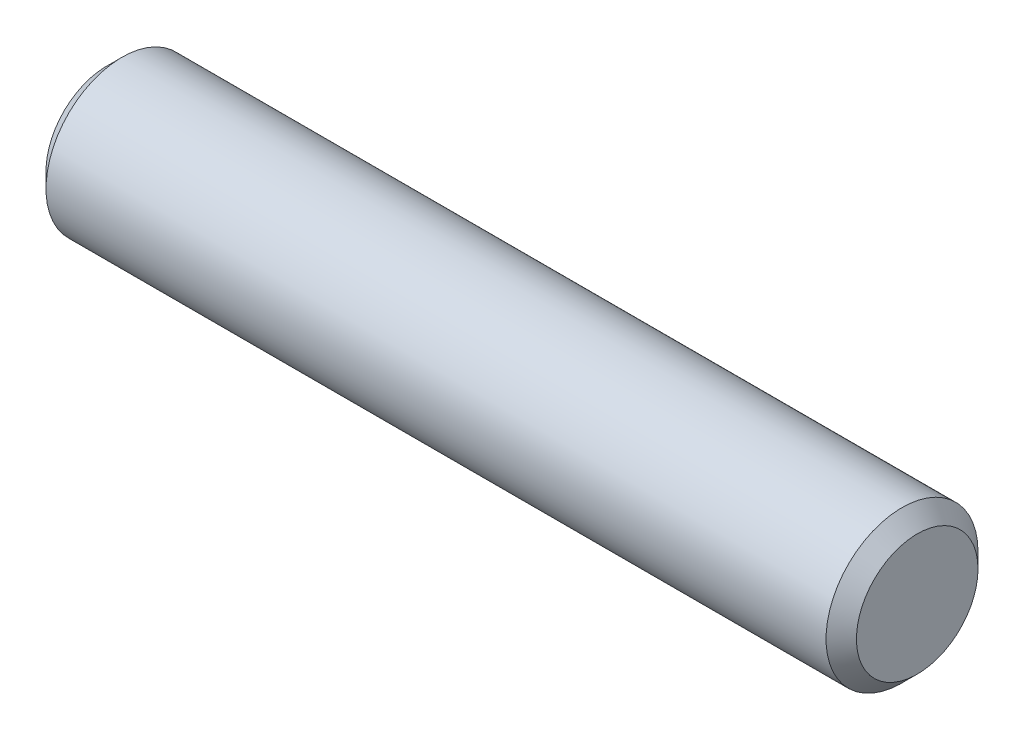
ISO-10303-21;
HEADER;
FILE_DESCRIPTION(('STEP AP214'),'2;1');
FILE_NAME('part.step','',(''),(''),'','','');
FILE_SCHEMA(('AUTOMOTIVE_DESIGN { 1 0 10303 214 1 1 1 1 }'));
ENDSEC;
DATA;
#1=APPLICATION_CONTEXT('core data for automotive mechanical design processes');
#2=APPLICATION_PROTOCOL_DEFINITION('international standard','automotive_design',2000,#1);
#3=PRODUCT_CONTEXT('',#1,'mechanical');
#4=PRODUCT('Part','Part','',(#3));
#5=PRODUCT_RELATED_PRODUCT_CATEGORY('part','',(#4));
#6=PRODUCT_DEFINITION_FORMATION('','',#4);
#7=PRODUCT_DEFINITION_CONTEXT('part definition',#1,'design');
#8=PRODUCT_DEFINITION('design','',#6,#7);
#9=PRODUCT_DEFINITION_SHAPE('','',#8);
#10=(LENGTH_UNIT() NAMED_UNIT(*) SI_UNIT(.MILLI.,.METRE.));
#11=(NAMED_UNIT(*) PLANE_ANGLE_UNIT() SI_UNIT($,.RADIAN.));
#12=(NAMED_UNIT(*) SI_UNIT($,.STERADIAN.) SOLID_ANGLE_UNIT());
#13=UNCERTAINTY_MEASURE_WITH_UNIT(LENGTH_MEASURE(1.E-05),#10,'distance_accuracy_value','');
#14=(GEOMETRIC_REPRESENTATION_CONTEXT(3) GLOBAL_UNCERTAINTY_ASSIGNED_CONTEXT((#13)) GLOBAL_UNIT_ASSIGNED_CONTEXT((#10,
#11,#12)) REPRESENTATION_CONTEXT('',''));
#15=CARTESIAN_POINT('',(0.,0.,0.));
#16=DIRECTION('',(0.,0.,1.));
#17=DIRECTION('',(1.,0.,0.));
#18=AXIS2_PLACEMENT_3D('',#15,#16,#17);
#19=CARTESIAN_POINT('',(-25.4,0.,0.));
#20=DIRECTION('',(1.,0.,0.));
#21=DIRECTION('',(0.,0.,-1.));
#22=AXIS2_PLACEMENT_3D('',#19,#20,#21);
#23=CYLINDRICAL_SURFACE('',#22,4.7625);
#24=CARTESIAN_POINT('',(24.4475,0.,0.));
#25=DIRECTION('',(1.,0.,0.));
#26=DIRECTION('',(0.,0.,-1.));
#27=AXIS2_PLACEMENT_3D('',#24,#25,#26);
#28=CIRCLE('',#27,4.7625);
#29=CARTESIAN_POINT('',(24.4475,0.,-4.7625));
#30=VERTEX_POINT('',#29);
#31=EDGE_CURVE('E40',#30,#30,#28,.F.);
#32=ORIENTED_EDGE('',*,*,#31,.T.);
#33=EDGE_LOOP('',(#32));
#34=FACE_BOUND('',#33,.T.);
#35=CARTESIAN_POINT('',(-24.4475,0.,0.));
#36=DIRECTION('',(1.,0.,0.));
#37=DIRECTION('',(0.,0.,-1.));
#38=AXIS2_PLACEMENT_3D('',#35,#36,#37);
#39=CIRCLE('',#38,4.7625);
#40=CARTESIAN_POINT('',(-24.4475,0.,-4.7625));
#41=VERTEX_POINT('',#40);
#42=EDGE_CURVE('E44',#41,#41,#39,.T.);
#43=ORIENTED_EDGE('',*,*,#42,.T.);
#44=EDGE_LOOP('',(#43));
#45=FACE_BOUND('',#44,.T.);
#46=ADVANCED_FACE('F33',(#34,#45),#23,.T.);
#47=CARTESIAN_POINT('',(-25.4,0.,0.));
#48=DIRECTION('',(1.,0.,0.));
#49=DIRECTION('',(0.,0.,-1.));
#50=AXIS2_PLACEMENT_3D('',#47,#48,#49);
#51=PLANE('',#50);
#52=CARTESIAN_POINT('',(-25.4,0.,0.));
#53=DIRECTION('',(1.,0.,0.));
#54=DIRECTION('',(0.,0.,-1.));
#55=AXIS2_PLACEMENT_3D('',#52,#53,#54);
#56=CIRCLE('',#55,3.81);
#57=CARTESIAN_POINT('',(-25.4,0.,-3.81));
#58=VERTEX_POINT('',#57);
#59=EDGE_CURVE('E10',#58,#58,#56,.F.);
#60=ORIENTED_EDGE('',*,*,#59,.T.);
#61=EDGE_LOOP('',(#60));
#62=FACE_BOUND('',#61,.T.);
#63=ADVANCED_FACE('F64',(#62),#51,.F.);
#64=CARTESIAN_POINT('',(25.4,0.,0.));
#65=DIRECTION('',(1.,0.,0.));
#66=DIRECTION('',(0.,0.,-1.));
#67=AXIS2_PLACEMENT_3D('',#64,#65,#66);
#68=PLANE('',#67);
#69=CARTESIAN_POINT('',(25.4,0.,0.));
#70=DIRECTION('',(1.,0.,0.));
#71=DIRECTION('',(0.,0.,-1.));
#72=AXIS2_PLACEMENT_3D('',#69,#70,#71);
#73=CIRCLE('',#72,3.81);
#74=CARTESIAN_POINT('',(25.4,0.,-3.81));
#75=VERTEX_POINT('',#74);
#76=EDGE_CURVE('E48',#75,#75,#73,.T.);
#77=ORIENTED_EDGE('',*,*,#76,.T.);
#78=EDGE_LOOP('',(#77));
#79=FACE_BOUND('',#78,.T.);
#80=ADVANCED_FACE('F54',(#79),#68,.T.);
#81=CARTESIAN_POINT('',(25.4,0.,0.));
#82=DIRECTION('',(-1.,0.,0.));
#83=DIRECTION('',(0.,0.,1.));
#84=AXIS2_PLACEMENT_3D('',#81,#82,#83);
#85=CONICAL_SURFACE('',#84,3.81,0.785398163397451);
#86=ORIENTED_EDGE('',*,*,#31,.F.);
#87=EDGE_LOOP('',(#86));
#88=FACE_BOUND('',#87,.T.);
#89=ORIENTED_EDGE('',*,*,#76,.F.);
#90=EDGE_LOOP('',(#89));
#91=FACE_BOUND('',#90,.T.);
#92=ADVANCED_FACE('F56',(#88,#91),#85,.T.);
#93=CARTESIAN_POINT('',(-24.4475,0.,0.));
#94=DIRECTION('',(1.,0.,0.));
#95=DIRECTION('',(0.,0.,-1.));
#96=AXIS2_PLACEMENT_3D('',#93,#94,#95);
#97=CONICAL_SURFACE('',#96,4.7625,0.785398163397451);
#98=ORIENTED_EDGE('',*,*,#59,.F.);
#99=EDGE_LOOP('',(#98));
#100=FACE_BOUND('',#99,.T.);
#101=ORIENTED_EDGE('',*,*,#42,.F.);
#102=EDGE_LOOP('',(#101));
#103=FACE_BOUND('',#102,.T.);
#104=ADVANCED_FACE('F35',(#100,#103),#97,.T.);
#105=CLOSED_SHELL('',(#46,#63,#80,#92,#104));
#106=MANIFOLD_SOLID_BREP('B2',#105);
#107=ADVANCED_BREP_SHAPE_REPRESENTATION('',(#18,#106),#14);
#108=SHAPE_DEFINITION_REPRESENTATION(#9,#107);
ENDSEC;
END-ISO-10303-21;
